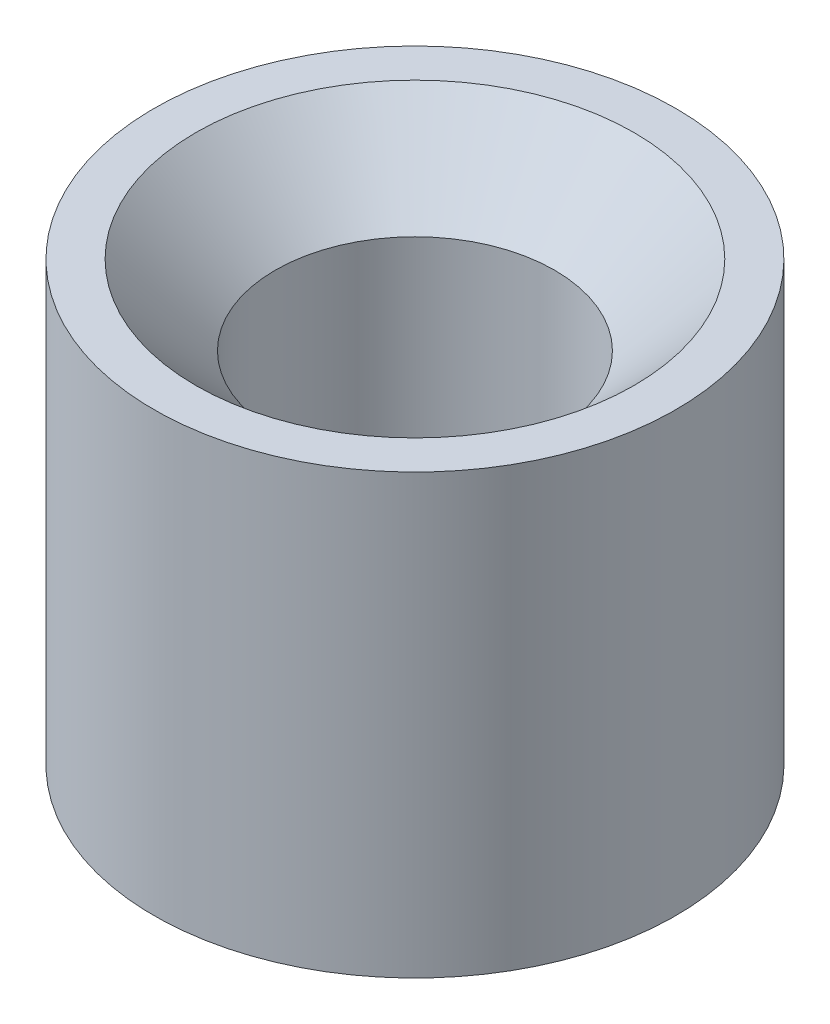
ISO-10303-21;
HEADER;
FILE_DESCRIPTION(('STEP AP214'),'2;1');
FILE_NAME('part.step','',(''),(''),'','','');
FILE_SCHEMA(('AUTOMOTIVE_DESIGN { 1 0 10303 214 1 1 1 1 }'));
ENDSEC;
DATA;
#1=APPLICATION_CONTEXT('core data for automotive mechanical design processes');
#2=APPLICATION_PROTOCOL_DEFINITION('international standard','automotive_design',2000,#1);
#3=PRODUCT_CONTEXT('',#1,'mechanical');
#4=PRODUCT('Part','Part','',(#3));
#5=PRODUCT_RELATED_PRODUCT_CATEGORY('part','',(#4));
#6=PRODUCT_DEFINITION_FORMATION('','',#4);
#7=PRODUCT_DEFINITION_CONTEXT('part definition',#1,'design');
#8=PRODUCT_DEFINITION('design','',#6,#7);
#9=PRODUCT_DEFINITION_SHAPE('','',#8);
#10=(LENGTH_UNIT() NAMED_UNIT(*) SI_UNIT(.MILLI.,.METRE.));
#11=(NAMED_UNIT(*) PLANE_ANGLE_UNIT() SI_UNIT($,.RADIAN.));
#12=(NAMED_UNIT(*) SI_UNIT($,.STERADIAN.) SOLID_ANGLE_UNIT());
#13=UNCERTAINTY_MEASURE_WITH_UNIT(LENGTH_MEASURE(1.E-05),#10,'distance_accuracy_value','');
#14=(GEOMETRIC_REPRESENTATION_CONTEXT(3) GLOBAL_UNCERTAINTY_ASSIGNED_CONTEXT((#13)) GLOBAL_UNIT_ASSIGNED_CONTEXT((#10,
#11,#12)) REPRESENTATION_CONTEXT('',''));
#15=CARTESIAN_POINT('',(0.,0.,0.));
#16=DIRECTION('',(0.,0.,1.));
#17=DIRECTION('',(1.,0.,0.));
#18=AXIS2_PLACEMENT_3D('',#15,#16,#17);
#19=CARTESIAN_POINT('',(3.12,5.24,0.));
#20=DIRECTION('',(0.,1.,0.));
#21=DIRECTION('',(0.,0.,1.));
#22=AXIS2_PLACEMENT_3D('',#19,#20,#21);
#23=PLANE('',#22);
#24=CARTESIAN_POINT('',(0.,5.24,0.));
#25=DIRECTION('',(0.,-1.,0.));
#26=DIRECTION('',(0.,0.,-1.));
#27=AXIS2_PLACEMENT_3D('',#24,#25,#26);
#28=CIRCLE('',#27,2.62);
#29=CARTESIAN_POINT('',(0.,5.24,-2.62));
#30=VERTEX_POINT('',#29);
#31=EDGE_CURVE('E10',#30,#30,#28,.T.);
#32=ORIENTED_EDGE('',*,*,#31,.T.);
#33=EDGE_LOOP('',(#32));
#34=FACE_BOUND('',#33,.T.);
#35=CARTESIAN_POINT('',(0.,5.24,0.));
#36=DIRECTION('',(0.,-1.,0.));
#37=DIRECTION('',(0.,0.,-1.));
#38=AXIS2_PLACEMENT_3D('',#35,#36,#37);
#39=CIRCLE('',#38,3.12);
#40=CARTESIAN_POINT('',(0.,5.24,-3.12));
#41=VERTEX_POINT('',#40);
#42=EDGE_CURVE('E55',#41,#41,#39,.T.);
#43=ORIENTED_EDGE('',*,*,#42,.F.);
#44=EDGE_LOOP('',(#43));
#45=FACE_BOUND('',#44,.T.);
#46=ADVANCED_FACE('F33',(#34,#45),#23,.T.);
#47=CARTESIAN_POINT('',(0.,5.24,0.));
#48=DIRECTION('',(0.,1.,0.));
#49=DIRECTION('',(0.,0.,1.));
#50=AXIS2_PLACEMENT_3D('',#47,#48,#49);
#51=CONICAL_SURFACE('',#50,2.62,0.785398163397447);
#52=CARTESIAN_POINT('',(0.,4.29,0.));
#53=DIRECTION('',(0.,-1.,0.));
#54=DIRECTION('',(0.,0.,-1.));
#55=AXIS2_PLACEMENT_3D('',#52,#53,#54);
#56=CIRCLE('',#55,1.67);
#57=CARTESIAN_POINT('',(0.,4.29,-1.67));
#58=VERTEX_POINT('',#57);
#59=EDGE_CURVE('E39',#58,#58,#56,.T.);
#60=ORIENTED_EDGE('',*,*,#59,.T.);
#61=EDGE_LOOP('',(#60));
#62=FACE_BOUND('',#61,.T.);
#63=ORIENTED_EDGE('',*,*,#31,.F.);
#64=EDGE_LOOP('',(#63));
#65=FACE_BOUND('',#64,.T.);
#66=ADVANCED_FACE('F63',(#62,#65),#51,.F.);
#67=CARTESIAN_POINT('',(0.,0.,0.));
#68=DIRECTION('',(0.,-1.,0.));
#69=DIRECTION('',(0.,0.,-1.));
#70=AXIS2_PLACEMENT_3D('',#67,#68,#69);
#71=CYLINDRICAL_SURFACE('',#70,1.67);
#72=CARTESIAN_POINT('',(0.,0.950000000000003,0.));
#73=DIRECTION('',(0.,-1.,0.));
#74=DIRECTION('',(0.,0.,-1.));
#75=AXIS2_PLACEMENT_3D('',#72,#73,#74);
#76=CIRCLE('',#75,1.67);
#77=CARTESIAN_POINT('',(0.,0.950000000000003,-1.67));
#78=VERTEX_POINT('',#77);
#79=EDGE_CURVE('E43',#78,#78,#76,.T.);
#80=ORIENTED_EDGE('',*,*,#79,.T.);
#81=EDGE_LOOP('',(#80));
#82=FACE_BOUND('',#81,.T.);
#83=ORIENTED_EDGE('',*,*,#59,.F.);
#84=EDGE_LOOP('',(#83));
#85=FACE_BOUND('',#84,.T.);
#86=ADVANCED_FACE('F67',(#82,#85),#71,.F.);
#87=CARTESIAN_POINT('',(0.,0.950000000000003,0.));
#88=DIRECTION('',(0.,-1.,0.));
#89=DIRECTION('',(0.,0.,-1.));
#90=AXIS2_PLACEMENT_3D('',#87,#88,#89);
#91=CONICAL_SURFACE('',#90,1.67,0.785398163397447);
#92=CARTESIAN_POINT('',(0.,0.,0.));
#93=DIRECTION('',(0.,-1.,0.));
#94=DIRECTION('',(0.,0.,-1.));
#95=AXIS2_PLACEMENT_3D('',#92,#93,#94);
#96=CIRCLE('',#95,2.62);
#97=CARTESIAN_POINT('',(0.,0.,-2.62));
#98=VERTEX_POINT('',#97);
#99=EDGE_CURVE('E47',#98,#98,#96,.T.);
#100=ORIENTED_EDGE('',*,*,#99,.T.);
#101=EDGE_LOOP('',(#100));
#102=FACE_BOUND('',#101,.T.);
#103=ORIENTED_EDGE('',*,*,#79,.F.);
#104=EDGE_LOOP('',(#103));
#105=FACE_BOUND('',#104,.T.);
#106=ADVANCED_FACE('F71',(#102,#105),#91,.F.);
#107=CARTESIAN_POINT('',(2.62,0.,0.));
#108=DIRECTION('',(0.,-1.,0.));
#109=DIRECTION('',(0.,0.,-1.));
#110=AXIS2_PLACEMENT_3D('',#107,#108,#109);
#111=PLANE('',#110);
#112=CARTESIAN_POINT('',(0.,0.,0.));
#113=DIRECTION('',(0.,-1.,0.));
#114=DIRECTION('',(0.,0.,-1.));
#115=AXIS2_PLACEMENT_3D('',#112,#113,#114);
#116=CIRCLE('',#115,3.12);
#117=CARTESIAN_POINT('',(0.,0.,-3.12));
#118=VERTEX_POINT('',#117);
#119=EDGE_CURVE('E52',#118,#118,#116,.T.);
#120=ORIENTED_EDGE('',*,*,#119,.T.);
#121=EDGE_LOOP('',(#120));
#122=FACE_BOUND('',#121,.T.);
#123=ORIENTED_EDGE('',*,*,#99,.F.);
#124=EDGE_LOOP('',(#123));
#125=FACE_BOUND('',#124,.T.);
#126=ADVANCED_FACE('F78',(#122,#125),#111,.T.);
#127=CARTESIAN_POINT('',(0.,0.,0.));
#128=DIRECTION('',(0.,-1.,0.));
#129=DIRECTION('',(0.,0.,-1.));
#130=AXIS2_PLACEMENT_3D('',#127,#128,#129);
#131=CYLINDRICAL_SURFACE('',#130,3.12);
#132=ORIENTED_EDGE('',*,*,#42,.T.);
#133=EDGE_LOOP('',(#132));
#134=FACE_BOUND('',#133,.T.);
#135=ORIENTED_EDGE('',*,*,#119,.F.);
#136=EDGE_LOOP('',(#135));
#137=FACE_BOUND('',#136,.T.);
#138=ADVANCED_FACE('F59',(#134,#137),#131,.T.);
#139=CLOSED_SHELL('',(#46,#66,#86,#106,#126,#138));
#140=MANIFOLD_SOLID_BREP('B2',#139);
#141=ADVANCED_BREP_SHAPE_REPRESENTATION('',(#18,#140),#14);
#142=SHAPE_DEFINITION_REPRESENTATION(#9,#141);
ENDSEC;
END-ISO-10303-21;
